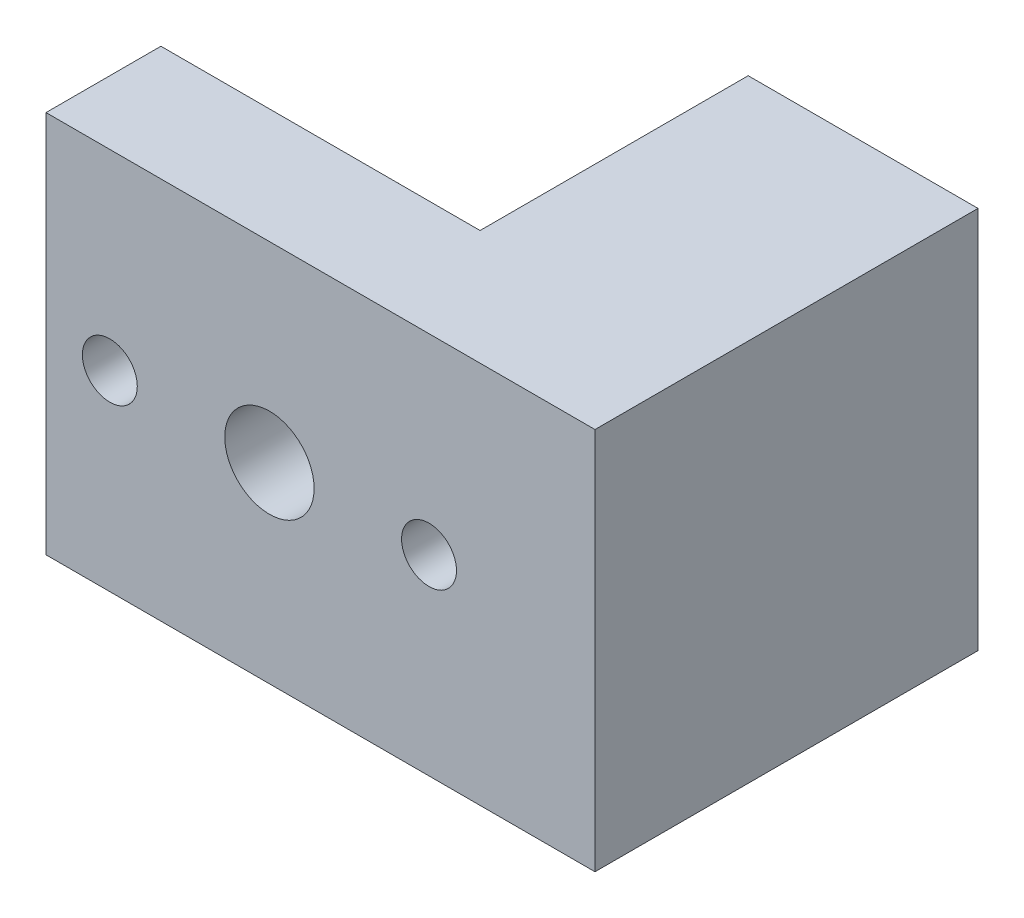
ISO-10303-21;
HEADER;
FILE_DESCRIPTION(('STEP AP214'),'2;1');
FILE_NAME('part.step','',(''),(''),'','','');
FILE_SCHEMA(('AUTOMOTIVE_DESIGN { 1 0 10303 214 1 1 1 1 }'));
ENDSEC;
DATA;
#1=APPLICATION_CONTEXT('core data for automotive mechanical design processes');
#2=APPLICATION_PROTOCOL_DEFINITION('international standard','automotive_design',2000,#1);
#3=PRODUCT_CONTEXT('',#1,'mechanical');
#4=PRODUCT('Part','Part','',(#3));
#5=PRODUCT_RELATED_PRODUCT_CATEGORY('part','',(#4));
#6=PRODUCT_DEFINITION_FORMATION('','',#4);
#7=PRODUCT_DEFINITION_CONTEXT('part definition',#1,'design');
#8=PRODUCT_DEFINITION('design','',#6,#7);
#9=PRODUCT_DEFINITION_SHAPE('','',#8);
#10=(LENGTH_UNIT() NAMED_UNIT(*) SI_UNIT(.MILLI.,.METRE.));
#11=(NAMED_UNIT(*) PLANE_ANGLE_UNIT() SI_UNIT($,.RADIAN.));
#12=(NAMED_UNIT(*) SI_UNIT($,.STERADIAN.) SOLID_ANGLE_UNIT());
#13=UNCERTAINTY_MEASURE_WITH_UNIT(LENGTH_MEASURE(1.E-05),#10,'distance_accuracy_value','');
#14=(GEOMETRIC_REPRESENTATION_CONTEXT(3) GLOBAL_UNCERTAINTY_ASSIGNED_CONTEXT((#13)) GLOBAL_UNIT_ASSIGNED_CONTEXT((#10,
#11,#12)) REPRESENTATION_CONTEXT('',''));
#15=CARTESIAN_POINT('',(0.,0.,0.));
#16=DIRECTION('',(0.,0.,1.));
#17=DIRECTION('',(1.,0.,0.));
#18=AXIS2_PLACEMENT_3D('',#15,#16,#17);
#19=CARTESIAN_POINT('',(0.,0.,9.));
#20=DIRECTION('',(0.,0.,-1.));
#21=DIRECTION('',(-1.,0.,0.));
#22=AXIS2_PLACEMENT_3D('',#19,#20,#21);
#23=PLANE('',#22);
#24=CARTESIAN_POINT('',(-302.700177836808,-47.5000000000202,9.));
#25=DIRECTION('',(0.,0.,1.));
#26=DIRECTION('',(1.,0.,0.));
#27=AXIS2_PLACEMENT_3D('',#24,#25,#26);
#28=CIRCLE('',#27,2.14999999999996);
#29=CARTESIAN_POINT('',(-300.550177836808,-47.5000000000202,9.));
#30=VERTEX_POINT('',#29);
#31=EDGE_CURVE('E155',#30,#30,#28,.T.);
#32=ORIENTED_EDGE('',*,*,#31,.F.);
#33=EDGE_LOOP('',(#32));
#34=FACE_BOUND('',#33,.T.);
#35=DIRECTION('',(0.,-1.,0.));
#36=VECTOR('',#35,1.);
#37=CARTESIAN_POINT('',(-332.700177836843,-62.500000000134,9.));
#38=LINE('',#37,#36);
#39=CARTESIAN_POINT('',(-332.700177836843,-32.500000000134,9.));
#40=VERTEX_POINT('',#39);
#41=CARTESIAN_POINT('',(-332.700177836843,-62.500000000134,9.));
#42=VERTEX_POINT('',#41);
#43=EDGE_CURVE('E134',#40,#42,#38,.T.);
#44=ORIENTED_EDGE('',*,*,#43,.T.);
#45=DIRECTION('',(1.,0.,0.));
#46=VECTOR('',#45,1.);
#47=CARTESIAN_POINT('',(-332.700177836843,-62.500000000134,9.));
#48=LINE('',#47,#46);
#49=CARTESIAN_POINT('',(-289.700177836843,-62.500000000134,9.));
#50=VERTEX_POINT('',#49);
#51=EDGE_CURVE('E79',#42,#50,#48,.T.);
#52=ORIENTED_EDGE('',*,*,#51,.T.);
#53=DIRECTION('',(0.,1.,0.));
#54=VECTOR('',#53,1.);
#55=CARTESIAN_POINT('',(-289.700177836843,-62.500000000134,9.));
#56=LINE('',#55,#54);
#57=CARTESIAN_POINT('',(-289.700177836843,-32.500000000134,9.));
#58=VERTEX_POINT('',#57);
#59=EDGE_CURVE('E137',#50,#58,#56,.T.);
#60=ORIENTED_EDGE('',*,*,#59,.T.);
#61=DIRECTION('',(-1.,0.,0.));
#62=VECTOR('',#61,1.);
#63=CARTESIAN_POINT('',(-332.700177836843,-32.500000000134,9.));
#64=LINE('',#63,#62);
#65=EDGE_CURVE('E59',#58,#40,#64,.T.);
#66=ORIENTED_EDGE('',*,*,#65,.T.);
#67=EDGE_LOOP('',(#44,#52,#60,#66));
#68=FACE_BOUND('',#67,.T.);
#69=CARTESIAN_POINT('',(-327.700177836784,-47.500000000134,9.));
#70=DIRECTION('',(0.,0.,1.));
#71=DIRECTION('',(1.,0.,0.));
#72=AXIS2_PLACEMENT_3D('',#69,#70,#71);
#73=CIRCLE('',#72,2.15000000000008);
#74=CARTESIAN_POINT('',(-325.550177836784,-47.500000000134,9.));
#75=VERTEX_POINT('',#74);
#76=EDGE_CURVE('E128',#75,#75,#73,.T.);
#77=ORIENTED_EDGE('',*,*,#76,.F.);
#78=EDGE_LOOP('',(#77));
#79=FACE_BOUND('',#78,.T.);
#80=CARTESIAN_POINT('',(-315.200177836843,-47.4999999999472,9.));
#81=DIRECTION('',(0.,0.,1.));
#82=DIRECTION('',(1.,0.,0.));
#83=AXIS2_PLACEMENT_3D('',#80,#81,#82);
#84=CIRCLE('',#83,3.50000000000002);
#85=CARTESIAN_POINT('',(-311.700177836843,-47.4999999999472,9.));
#86=VERTEX_POINT('',#85);
#87=EDGE_CURVE('E120',#86,#86,#84,.T.);
#88=ORIENTED_EDGE('',*,*,#87,.F.);
#89=EDGE_LOOP('',(#88));
#90=FACE_BOUND('',#89,.T.);
#91=ADVANCED_FACE('F35',(#34,#68,#79,#90),#23,.F.);
#92=CARTESIAN_POINT('',(0.,0.,0.));
#93=DIRECTION('',(0.,0.,-1.));
#94=DIRECTION('',(-1.,0.,0.));
#95=AXIS2_PLACEMENT_3D('',#92,#93,#94);
#96=PLANE('',#95);
#97=DIRECTION('',(0.,1.,0.));
#98=VECTOR('',#97,1.);
#99=CARTESIAN_POINT('',(-307.700177836843,-62.500000000134,0.));
#100=LINE('',#99,#98);
#101=CARTESIAN_POINT('',(-307.700177836843,-62.500000000134,0.));
#102=VERTEX_POINT('',#101);
#103=CARTESIAN_POINT('',(-307.700177836843,-32.500000000134,0.));
#104=VERTEX_POINT('',#103);
#105=EDGE_CURVE('E50',#102,#104,#100,.T.);
#106=ORIENTED_EDGE('',*,*,#105,.F.);
#107=DIRECTION('',(1.,0.,0.));
#108=VECTOR('',#107,1.);
#109=CARTESIAN_POINT('',(-332.700177836843,-62.500000000134,0.));
#110=LINE('',#109,#108);
#111=CARTESIAN_POINT('',(-332.700177836843,-62.500000000134,0.));
#112=VERTEX_POINT('',#111);
#113=EDGE_CURVE('E143',#112,#102,#110,.T.);
#114=ORIENTED_EDGE('',*,*,#113,.F.);
#115=DIRECTION('',(0.,-1.,0.));
#116=VECTOR('',#115,1.);
#117=CARTESIAN_POINT('',(-332.700177836843,-62.500000000134,0.));
#118=LINE('',#117,#116);
#119=CARTESIAN_POINT('',(-332.700177836843,-32.500000000134,0.));
#120=VERTEX_POINT('',#119);
#121=EDGE_CURVE('E131',#120,#112,#118,.T.);
#122=ORIENTED_EDGE('',*,*,#121,.F.);
#123=DIRECTION('',(-1.,0.,0.));
#124=VECTOR('',#123,1.);
#125=CARTESIAN_POINT('',(-332.700177836843,-32.500000000134,0.));
#126=LINE('',#125,#124);
#127=EDGE_CURVE('E72',#104,#120,#126,.T.);
#128=ORIENTED_EDGE('',*,*,#127,.F.);
#129=EDGE_LOOP('',(#106,#114,#122,#128));
#130=FACE_BOUND('',#129,.T.);
#131=CARTESIAN_POINT('',(-327.700177836784,-47.500000000134,0.));
#132=DIRECTION('',(0.,0.,1.));
#133=DIRECTION('',(1.,0.,0.));
#134=AXIS2_PLACEMENT_3D('',#131,#132,#133);
#135=CIRCLE('',#134,2.15000000000008);
#136=CARTESIAN_POINT('',(-325.550177836784,-47.500000000134,0.));
#137=VERTEX_POINT('',#136);
#138=EDGE_CURVE('E126',#137,#137,#135,.T.);
#139=ORIENTED_EDGE('',*,*,#138,.T.);
#140=EDGE_LOOP('',(#139));
#141=FACE_BOUND('',#140,.T.);
#142=CARTESIAN_POINT('',(-315.200177836843,-47.4999999999472,0.));
#143=DIRECTION('',(0.,0.,1.));
#144=DIRECTION('',(1.,0.,0.));
#145=AXIS2_PLACEMENT_3D('',#142,#143,#144);
#146=CIRCLE('',#145,3.50000000000002);
#147=CARTESIAN_POINT('',(-311.700177836843,-47.4999999999472,0.));
#148=VERTEX_POINT('',#147);
#149=EDGE_CURVE('E116',#148,#148,#146,.T.);
#150=ORIENTED_EDGE('',*,*,#149,.T.);
#151=EDGE_LOOP('',(#150));
#152=FACE_BOUND('',#151,.T.);
#153=ADVANCED_FACE('F166',(#130,#141,#152),#96,.T.);
#154=CARTESIAN_POINT('',(-332.700177836843,-62.500000000134,9.));
#155=DIRECTION('',(1.,0.,0.));
#156=DIRECTION('',(0.,0.,-1.));
#157=AXIS2_PLACEMENT_3D('',#154,#155,#156);
#158=PLANE('',#157);
#159=ORIENTED_EDGE('',*,*,#121,.T.);
#160=DIRECTION('',(0.,0.,-1.));
#161=VECTOR('',#160,1.);
#162=CARTESIAN_POINT('',(-332.700177836843,-62.500000000134,9.));
#163=LINE('',#162,#161);
#164=EDGE_CURVE('E11',#42,#112,#163,.T.);
#165=ORIENTED_EDGE('',*,*,#164,.F.);
#166=ORIENTED_EDGE('',*,*,#43,.F.);
#167=DIRECTION('',(0.,0.,-1.));
#168=VECTOR('',#167,1.);
#169=CARTESIAN_POINT('',(-332.700177836843,-32.500000000134,9.));
#170=LINE('',#169,#168);
#171=EDGE_CURVE('E140',#40,#120,#170,.T.);
#172=ORIENTED_EDGE('',*,*,#171,.T.);
#173=EDGE_LOOP('',(#159,#165,#166,#172));
#174=FACE_BOUND('',#173,.T.);
#175=ADVANCED_FACE('F37',(#174),#158,.F.);
#176=CARTESIAN_POINT('',(-332.700177836843,-62.500000000134,9.));
#177=DIRECTION('',(0.,1.,0.));
#178=DIRECTION('',(-1.,0.,0.));
#179=AXIS2_PLACEMENT_3D('',#176,#177,#178);
#180=PLANE('',#179);
#181=ORIENTED_EDGE('',*,*,#113,.T.);
#182=DIRECTION('',(0.,0.,1.));
#183=VECTOR('',#182,1.);
#184=CARTESIAN_POINT('',(-307.700177836843,-62.500000000134,-21.0000000000001));
#185=LINE('',#184,#183);
#186=CARTESIAN_POINT('',(-307.700177836843,-62.500000000134,-21.0000000000001));
#187=VERTEX_POINT('',#186);
#188=EDGE_CURVE('E117',#187,#102,#185,.T.);
#189=ORIENTED_EDGE('',*,*,#188,.F.);
#190=DIRECTION('',(-1.,0.,0.));
#191=VECTOR('',#190,1.);
#192=CARTESIAN_POINT('',(-307.700177836843,-62.500000000134,-21.0000000000001));
#193=LINE('',#192,#191);
#194=CARTESIAN_POINT('',(-289.700177836843,-62.500000000134,-21.0000000000001));
#195=VERTEX_POINT('',#194);
#196=EDGE_CURVE('E110',#195,#187,#193,.T.);
#197=ORIENTED_EDGE('',*,*,#196,.F.);
#198=DIRECTION('',(0.,0.,-1.));
#199=VECTOR('',#198,1.);
#200=CARTESIAN_POINT('',(-289.700177836843,-62.500000000134,9.));
#201=LINE('',#200,#199);
#202=EDGE_CURVE('E43',#50,#195,#201,.T.);
#203=ORIENTED_EDGE('',*,*,#202,.F.);
#204=ORIENTED_EDGE('',*,*,#51,.F.);
#205=ORIENTED_EDGE('',*,*,#164,.T.);
#206=EDGE_LOOP('',(#181,#189,#197,#203,#204,#205));
#207=FACE_BOUND('',#206,.T.);
#208=ADVANCED_FACE('F151',(#207),#180,.F.);
#209=CARTESIAN_POINT('',(-289.700177836843,-62.500000000134,9.));
#210=DIRECTION('',(-1.,0.,0.));
#211=DIRECTION('',(0.,0.,1.));
#212=AXIS2_PLACEMENT_3D('',#209,#210,#211);
#213=PLANE('',#212);
#214=ORIENTED_EDGE('',*,*,#202,.T.);
#215=DIRECTION('',(0.,-1.,0.));
#216=VECTOR('',#215,1.);
#217=CARTESIAN_POINT('',(-289.700177836843,-62.500000000134,-21.0000000000001));
#218=LINE('',#217,#216);
#219=CARTESIAN_POINT('',(-289.700177836843,-32.500000000134,-21.0000000000001));
#220=VERTEX_POINT('',#219);
#221=EDGE_CURVE('E104',#220,#195,#218,.T.);
#222=ORIENTED_EDGE('',*,*,#221,.F.);
#223=DIRECTION('',(0.,0.,-1.));
#224=VECTOR('',#223,1.);
#225=CARTESIAN_POINT('',(-289.700177836843,-32.500000000134,9.));
#226=LINE('',#225,#224);
#227=EDGE_CURVE('E100',#58,#220,#226,.T.);
#228=ORIENTED_EDGE('',*,*,#227,.F.);
#229=ORIENTED_EDGE('',*,*,#59,.F.);
#230=EDGE_LOOP('',(#214,#222,#228,#229));
#231=FACE_BOUND('',#230,.T.);
#232=ADVANCED_FACE('F149',(#231),#213,.F.);
#233=CARTESIAN_POINT('',(-332.700177836843,-32.500000000134,9.));
#234=DIRECTION('',(0.,-1.,0.));
#235=DIRECTION('',(0.,0.,-1.));
#236=AXIS2_PLACEMENT_3D('',#233,#234,#235);
#237=PLANE('',#236);
#238=ORIENTED_EDGE('',*,*,#227,.T.);
#239=DIRECTION('',(1.,0.,0.));
#240=VECTOR('',#239,1.);
#241=CARTESIAN_POINT('',(-307.700177836843,-32.500000000134,-21.0000000000001));
#242=LINE('',#241,#240);
#243=CARTESIAN_POINT('',(-307.700177836843,-32.500000000134,-21.0000000000001));
#244=VERTEX_POINT('',#243);
#245=EDGE_CURVE('E94',#244,#220,#242,.T.);
#246=ORIENTED_EDGE('',*,*,#245,.F.);
#247=DIRECTION('',(0.,0.,1.));
#248=VECTOR('',#247,1.);
#249=CARTESIAN_POINT('',(-307.700177836843,-32.500000000134,-21.0000000000001));
#250=LINE('',#249,#248);
#251=EDGE_CURVE('E98',#244,#104,#250,.T.);
#252=ORIENTED_EDGE('',*,*,#251,.T.);
#253=ORIENTED_EDGE('',*,*,#127,.T.);
#254=ORIENTED_EDGE('',*,*,#171,.F.);
#255=ORIENTED_EDGE('',*,*,#65,.F.);
#256=EDGE_LOOP('',(#238,#246,#252,#253,#254,#255));
#257=FACE_BOUND('',#256,.T.);
#258=ADVANCED_FACE('F96',(#257),#237,.F.);
#259=CARTESIAN_POINT('',(-327.700177836784,-47.500000000134,9.));
#260=DIRECTION('',(0.,0.,-1.));
#261=DIRECTION('',(-1.,0.,0.));
#262=AXIS2_PLACEMENT_3D('',#259,#260,#261);
#263=CYLINDRICAL_SURFACE('',#262,2.15000000000008);
#264=ORIENTED_EDGE('',*,*,#76,.T.);
#265=EDGE_LOOP('',(#264));
#266=FACE_BOUND('',#265,.T.);
#267=ORIENTED_EDGE('',*,*,#138,.F.);
#268=EDGE_LOOP('',(#267));
#269=FACE_BOUND('',#268,.T.);
#270=ADVANCED_FACE('F178',(#266,#269),#263,.F.);
#271=CARTESIAN_POINT('',(-315.200177836843,-47.4999999999472,9.));
#272=DIRECTION('',(0.,0.,-1.));
#273=DIRECTION('',(-1.,0.,0.));
#274=AXIS2_PLACEMENT_3D('',#271,#272,#273);
#275=CYLINDRICAL_SURFACE('',#274,3.50000000000002);
#276=ORIENTED_EDGE('',*,*,#87,.T.);
#277=EDGE_LOOP('',(#276));
#278=FACE_BOUND('',#277,.T.);
#279=ORIENTED_EDGE('',*,*,#149,.F.);
#280=EDGE_LOOP('',(#279));
#281=FACE_BOUND('',#280,.T.);
#282=ADVANCED_FACE('F175',(#278,#281),#275,.F.);
#283=CARTESIAN_POINT('',(-307.700177836843,-62.500000000134,-21.0000000000001));
#284=DIRECTION('',(1.,0.,0.));
#285=DIRECTION('',(0.,0.,-1.));
#286=AXIS2_PLACEMENT_3D('',#283,#284,#285);
#287=PLANE('',#286);
#288=ORIENTED_EDGE('',*,*,#105,.T.);
#289=ORIENTED_EDGE('',*,*,#251,.F.);
#290=DIRECTION('',(0.,1.,0.));
#291=VECTOR('',#290,1.);
#292=CARTESIAN_POINT('',(-307.700177836843,-62.500000000134,-21.0000000000001));
#293=LINE('',#292,#291);
#294=EDGE_CURVE('E105',#187,#244,#293,.T.);
#295=ORIENTED_EDGE('',*,*,#294,.F.);
#296=ORIENTED_EDGE('',*,*,#188,.T.);
#297=EDGE_LOOP('',(#288,#289,#295,#296));
#298=FACE_BOUND('',#297,.T.);
#299=ADVANCED_FACE('F115',(#298),#287,.F.);
#300=CARTESIAN_POINT('',(0.,0.,-21.0000000000001));
#301=DIRECTION('',(0.,0.,-1.));
#302=DIRECTION('',(-1.,0.,0.));
#303=AXIS2_PLACEMENT_3D('',#300,#301,#302);
#304=PLANE('',#303);
#305=CARTESIAN_POINT('',(-302.700177836808,-47.5000000000202,-21.0000000000001));
#306=DIRECTION('',(0.,0.,1.));
#307=DIRECTION('',(1.,0.,0.));
#308=AXIS2_PLACEMENT_3D('',#305,#306,#307);
#309=CIRCLE('',#308,2.14999999999996);
#310=CARTESIAN_POINT('',(-300.550177836808,-47.5000000000202,-21.0000000000001));
#311=VERTEX_POINT('',#310);
#312=EDGE_CURVE('E153',#311,#311,#309,.T.);
#313=ORIENTED_EDGE('',*,*,#312,.T.);
#314=EDGE_LOOP('',(#313));
#315=FACE_BOUND('',#314,.T.);
#316=ORIENTED_EDGE('',*,*,#294,.T.);
#317=ORIENTED_EDGE('',*,*,#245,.T.);
#318=ORIENTED_EDGE('',*,*,#221,.T.);
#319=ORIENTED_EDGE('',*,*,#196,.T.);
#320=EDGE_LOOP('',(#316,#317,#318,#319));
#321=FACE_BOUND('',#320,.T.);
#322=ADVANCED_FACE('F108',(#315,#321),#304,.T.);
#323=CARTESIAN_POINT('',(-302.700177836808,-47.5000000000202,-21.0000000000001));
#324=DIRECTION('',(0.,0.,1.));
#325=DIRECTION('',(1.,0.,0.));
#326=AXIS2_PLACEMENT_3D('',#323,#324,#325);
#327=CYLINDRICAL_SURFACE('',#326,2.14999999999996);
#328=ORIENTED_EDGE('',*,*,#312,.F.);
#329=EDGE_LOOP('',(#328));
#330=FACE_BOUND('',#329,.T.);
#331=ORIENTED_EDGE('',*,*,#31,.T.);
#332=EDGE_LOOP('',(#331));
#333=FACE_BOUND('',#332,.T.);
#334=ADVANCED_FACE('F163',(#330,#333),#327,.F.);
#335=CLOSED_SHELL('',(#91,#153,#175,#208,#232,#258,#270,#282,#299,#322,#334));
#336=MANIFOLD_SOLID_BREP('B2',#335);
#337=ADVANCED_BREP_SHAPE_REPRESENTATION('',(#18,#336),#14);
#338=SHAPE_DEFINITION_REPRESENTATION(#9,#337);
ENDSEC;
END-ISO-10303-21;
